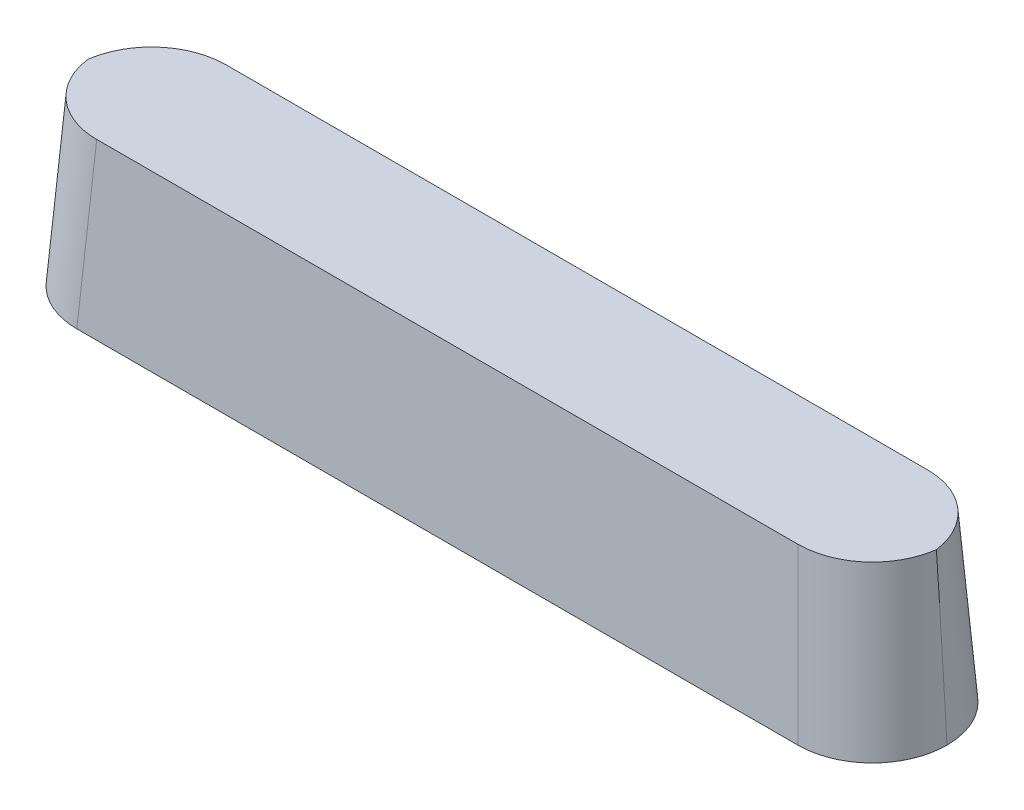
ISO-10303-21;
HEADER;
FILE_DESCRIPTION(('STEP AP214'),'2;1');
FILE_NAME('part.step','',(''),(''),'','','');
FILE_SCHEMA(('AUTOMOTIVE_DESIGN { 1 0 10303 214 1 1 1 1 }'));
ENDSEC;
DATA;
#1=APPLICATION_CONTEXT('core data for automotive mechanical design processes');
#2=APPLICATION_PROTOCOL_DEFINITION('international standard','automotive_design',2000,#1);
#3=PRODUCT_CONTEXT('',#1,'mechanical');
#4=PRODUCT('Part','Part','',(#3));
#5=PRODUCT_RELATED_PRODUCT_CATEGORY('part','',(#4));
#6=PRODUCT_DEFINITION_FORMATION('','',#4);
#7=PRODUCT_DEFINITION_CONTEXT('part definition',#1,'design');
#8=PRODUCT_DEFINITION('design','',#6,#7);
#9=PRODUCT_DEFINITION_SHAPE('','',#8);
#10=(LENGTH_UNIT() NAMED_UNIT(*) SI_UNIT(.MILLI.,.METRE.));
#11=(NAMED_UNIT(*) PLANE_ANGLE_UNIT() SI_UNIT($,.RADIAN.));
#12=(NAMED_UNIT(*) SI_UNIT($,.STERADIAN.) SOLID_ANGLE_UNIT());
#13=UNCERTAINTY_MEASURE_WITH_UNIT(LENGTH_MEASURE(1.E-05),#10,'distance_accuracy_value','');
#14=(GEOMETRIC_REPRESENTATION_CONTEXT(3) GLOBAL_UNCERTAINTY_ASSIGNED_CONTEXT((#13)) GLOBAL_UNIT_ASSIGNED_CONTEXT((#10,
#11,#12)) REPRESENTATION_CONTEXT('',''));
#15=CARTESIAN_POINT('',(0.,0.,0.));
#16=DIRECTION('',(0.,0.,1.));
#17=DIRECTION('',(1.,0.,0.));
#18=AXIS2_PLACEMENT_3D('',#15,#16,#17);
#19=CARTESIAN_POINT('',(0.,33.,0.));
#20=DIRECTION('',(0.,1.,0.));
#21=DIRECTION('',(0.,0.,1.));
#22=AXIS2_PLACEMENT_3D('',#19,#20,#21);
#23=PLANE('',#22);
#24=CARTESIAN_POINT('',(70.4724770410759,33.,-2.02752295892413));
#25=DIRECTION('',(0.,1.,0.));
#26=DIRECTION('',(-0.707106781186548,0.,-0.707106781186547));
#27=AXIS2_PLACEMENT_3D('',#24,#25,#26);
#28=ELLIPSE('',#27,15.0549956015265,15.);
#29=CARTESIAN_POINT('',(70.5274725505321,33.,13.));
#30=VERTEX_POINT('',#29);
#31=CARTESIAN_POINT('',(85.369914782845,33.,0.));
#32=VERTEX_POINT('',#31);
#33=EDGE_CURVE('E302',#30,#32,#28,.T.);
#34=ORIENTED_EDGE('',*,*,#33,.T.);
#35=CARTESIAN_POINT('',(70.4724770410759,33.,2.02752295892412));
#36=DIRECTION('',(0.,1.,0.));
#37=DIRECTION('',(-0.707106781186552,0.,0.707106781186544));
#38=AXIS2_PLACEMENT_3D('',#35,#36,#37);
#39=ELLIPSE('',#38,15.0549956015265,15.);
#40=CARTESIAN_POINT('',(70.5274725505321,33.,-13.));
#41=VERTEX_POINT('',#40);
#42=EDGE_CURVE('E215',#32,#41,#39,.T.);
#43=ORIENTED_EDGE('',*,*,#42,.T.);
#44=DIRECTION('',(-1.,0.,0.));
#45=VECTOR('',#44,1.);
#46=CARTESIAN_POINT('',(85.5,33.,-13.));
#47=LINE('',#46,#45);
#48=CARTESIAN_POINT('',(-70.5274725505321,33.,-13.));
#49=VERTEX_POINT('',#48);
#50=EDGE_CURVE('E160',#41,#49,#47,.T.);
#51=ORIENTED_EDGE('',*,*,#50,.T.);
#52=CARTESIAN_POINT('',(-70.4724770410758,33.,2.02752295892412));
#53=DIRECTION('',(0.,1.,0.));
#54=DIRECTION('',(0.707106781186552,0.,0.707106781186544));
#55=AXIS2_PLACEMENT_3D('',#52,#53,#54);
#56=ELLIPSE('',#55,15.0549956015265,15.);
#57=CARTESIAN_POINT('',(-85.3699147828449,33.,0.));
#58=VERTEX_POINT('',#57);
#59=EDGE_CURVE('E298',#49,#58,#56,.T.);
#60=ORIENTED_EDGE('',*,*,#59,.T.);
#61=CARTESIAN_POINT('',(-70.4724770410758,33.,-2.02752295892413));
#62=DIRECTION('',(0.,1.,0.));
#63=DIRECTION('',(0.707106781186548,0.,-0.707106781186547));
#64=AXIS2_PLACEMENT_3D('',#61,#62,#63);
#65=ELLIPSE('',#64,15.0549956015265,15.);
#66=CARTESIAN_POINT('',(-70.5274725505321,33.,13.));
#67=VERTEX_POINT('',#66);
#68=EDGE_CURVE('E296',#58,#67,#65,.T.);
#69=ORIENTED_EDGE('',*,*,#68,.T.);
#70=DIRECTION('',(1.,0.,0.));
#71=VECTOR('',#70,1.);
#72=CARTESIAN_POINT('',(85.5,33.,13.));
#73=LINE('',#72,#71);
#74=EDGE_CURVE('E291',#67,#30,#73,.T.);
#75=ORIENTED_EDGE('',*,*,#74,.T.);
#76=EDGE_LOOP('',(#34,#43,#51,#60,#69,#75));
#77=FACE_BOUND('',#76,.T.);
#78=ADVANCED_FACE('F44',(#77),#23,.T.);
#79=CARTESIAN_POINT('',(0.,0.,0.));
#80=DIRECTION('',(0.,1.,0.));
#81=DIRECTION('',(0.,0.,1.));
#82=AXIS2_PLACEMENT_3D('',#79,#80,#81);
#83=PLANE('',#82);
#84=DIRECTION('',(-1.,0.,0.));
#85=VECTOR('',#84,1.);
#86=CARTESIAN_POINT('',(87.5,0.,-15.));
#87=LINE('',#86,#85);
#88=CARTESIAN_POINT('',(72.5274725505322,0.,-15.));
#89=VERTEX_POINT('',#88);
#90=CARTESIAN_POINT('',(-72.5274725505321,0.,-15.));
#91=VERTEX_POINT('',#90);
#92=EDGE_CURVE('E48',#89,#91,#87,.T.);
#93=ORIENTED_EDGE('',*,*,#92,.F.);
#94=CARTESIAN_POINT('',(72.4724770410759,0.,0.027522958924139));
#95=DIRECTION('',(0.,1.,0.));
#96=DIRECTION('',(-0.707106781186552,0.,0.707106781186544));
#97=AXIS2_PLACEMENT_3D('',#94,#95,#96);
#98=ELLIPSE('',#97,15.0549956015265,15.);
#99=CARTESIAN_POINT('',(87.5,0.,-0.027472550532124));
#100=VERTEX_POINT('',#99);
#101=EDGE_CURVE('E128',#89,#100,#98,.F.);
#102=ORIENTED_EDGE('',*,*,#101,.T.);
#103=DIRECTION('',(0.,0.,-1.));
#104=VECTOR('',#103,1.);
#105=CARTESIAN_POINT('',(87.5,0.,15.));
#106=LINE('',#105,#104);
#107=CARTESIAN_POINT('',(87.5,0.,0.0274725505321292));
#108=VERTEX_POINT('',#107);
#109=EDGE_CURVE('E116',#108,#100,#106,.T.);
#110=ORIENTED_EDGE('',*,*,#109,.F.);
#111=CARTESIAN_POINT('',(72.4724770410759,0.,-0.0275229589241337));
#112=DIRECTION('',(0.,1.,0.));
#113=DIRECTION('',(-0.707106781186548,0.,-0.707106781186547));
#114=AXIS2_PLACEMENT_3D('',#111,#112,#113);
#115=ELLIPSE('',#114,15.0549956015265,15.);
#116=CARTESIAN_POINT('',(72.5274725505321,0.,15.));
#117=VERTEX_POINT('',#116);
#118=EDGE_CURVE('E68',#108,#117,#115,.F.);
#119=ORIENTED_EDGE('',*,*,#118,.T.);
#120=DIRECTION('',(1.,0.,0.));
#121=VECTOR('',#120,1.);
#122=CARTESIAN_POINT('',(87.5,0.,15.));
#123=LINE('',#122,#121);
#124=CARTESIAN_POINT('',(-72.5274725505321,0.,15.));
#125=VERTEX_POINT('',#124);
#126=EDGE_CURVE('E122',#125,#117,#123,.T.);
#127=ORIENTED_EDGE('',*,*,#126,.F.);
#128=CARTESIAN_POINT('',(-72.4724770410758,0.,-0.0275229589241337));
#129=DIRECTION('',(0.,1.,0.));
#130=DIRECTION('',(0.707106781186548,0.,-0.707106781186547));
#131=AXIS2_PLACEMENT_3D('',#128,#129,#130);
#132=ELLIPSE('',#131,15.0549956015265,15.);
#133=CARTESIAN_POINT('',(-87.5,0.,0.0274725505321309));
#134=VERTEX_POINT('',#133);
#135=EDGE_CURVE('E139',#125,#134,#132,.F.);
#136=ORIENTED_EDGE('',*,*,#135,.T.);
#137=DIRECTION('',(0.,0.,1.));
#138=VECTOR('',#137,1.);
#139=CARTESIAN_POINT('',(-87.5,0.,15.));
#140=LINE('',#139,#138);
#141=CARTESIAN_POINT('',(-87.5,0.,-0.0274725505321222));
#142=VERTEX_POINT('',#141);
#143=EDGE_CURVE('E224',#142,#134,#140,.T.);
#144=ORIENTED_EDGE('',*,*,#143,.F.);
#145=CARTESIAN_POINT('',(-72.4724770410758,0.,0.0275229589241389));
#146=DIRECTION('',(0.,1.,0.));
#147=DIRECTION('',(0.707106781186552,0.,0.707106781186544));
#148=AXIS2_PLACEMENT_3D('',#145,#146,#147);
#149=ELLIPSE('',#148,15.0549956015265,15.);
#150=EDGE_CURVE('E135',#142,#91,#149,.F.);
#151=ORIENTED_EDGE('',*,*,#150,.T.);
#152=EDGE_LOOP('',(#93,#102,#110,#119,#127,#136,#144,#151));
#153=FACE_BOUND('',#152,.T.);
#154=ADVANCED_FACE('F126',(#153),#83,.F.);
#155=CARTESIAN_POINT('',(0.,0.905763952424519,14.9451052150046));
#156=DIRECTION('',(0.,-0.0604950604018904,-0.998168496631191));
#157=DIRECTION('',(0.,0.998168496631191,-0.0604950604018904));
#158=AXIS2_PLACEMENT_3D('',#155,#156,#157);
#159=PLANE('',#158);
#160=ORIENTED_EDGE('',*,*,#126,.T.);
#161=DIRECTION('',(-0.0603846678639169,0.996347019754628,-0.0603846678639168));
#162=VECTOR('',#161,1.);
#163=CARTESIAN_POINT('',(72.2083204172576,5.26601019902928,14.6808478667255));
#164=LINE('',#163,#162);
#165=EDGE_CURVE('E134',#117,#30,#164,.T.);
#166=ORIENTED_EDGE('',*,*,#165,.T.);
#167=ORIENTED_EDGE('',*,*,#74,.F.);
#168=DIRECTION('',(0.0603846678639169,0.996347019754628,-0.0603846678639168));
#169=VECTOR('',#168,1.);
#170=CARTESIAN_POINT('',(-72.2083204172576,5.26601019902928,14.6808478667255));
#171=LINE('',#170,#169);
#172=EDGE_CURVE('E137',#67,#125,#171,.F.);
#173=ORIENTED_EDGE('',*,*,#172,.T.);
#174=EDGE_LOOP('',(#160,#166,#167,#173));
#175=FACE_BOUND('',#174,.T.);
#176=ADVANCED_FACE('F184',(#175),#159,.F.);
#177=CARTESIAN_POINT('',(-87.17978042086,5.2836230558097,0.));
#178=DIRECTION('',(0.998168496631191,-0.0604950604018904,0.));
#179=DIRECTION('',(0.0604950604018904,0.998168496631191,0.));
#180=AXIS2_PLACEMENT_3D('',#177,#178,#179);
#181=PLANE('',#180);
#182=DIRECTION('',(0.0603846678639169,0.996347019754628,-0.0603846678639168));
#183=VECTOR('',#182,1.);
#184=CARTESIAN_POINT('',(-87.1808478667254,5.26601019902928,-0.291679582742372));
#185=LINE('',#184,#183);
#186=CARTESIAN_POINT('',(-87.4725274494678,0.4532970837801,0.));
#187=VERTEX_POINT('',#186);
#188=EDGE_CURVE('E54',#134,#187,#185,.T.);
#189=ORIENTED_EDGE('',*,*,#188,.T.);
#190=DIRECTION('',(0.0603846678639169,0.996347019754628,0.0603846678639162));
#191=VECTOR('',#190,1.);
#192=CARTESIAN_POINT('',(-87.1808478667254,5.26601019902928,0.291679582742374));
#193=LINE('',#192,#191);
#194=EDGE_CURVE('E12',#187,#142,#193,.F.);
#195=ORIENTED_EDGE('',*,*,#194,.T.);
#196=ORIENTED_EDGE('',*,*,#143,.T.);
#197=EDGE_LOOP('',(#189,#195,#196));
#198=FACE_BOUND('',#197,.T.);
#199=ADVANCED_FACE('F235',(#198),#181,.F.);
#200=CARTESIAN_POINT('',(87.17978042086,5.2836230558097,0.));
#201=DIRECTION('',(-0.998168496631191,-0.0604950604018904,0.));
#202=DIRECTION('',(0.0604950604018904,-0.998168496631191,0.));
#203=AXIS2_PLACEMENT_3D('',#200,#201,#202);
#204=PLANE('',#203);
#205=ORIENTED_EDGE('',*,*,#109,.T.);
#206=DIRECTION('',(-0.0603846678639169,0.996347019754628,0.0603846678639162));
#207=VECTOR('',#206,1.);
#208=CARTESIAN_POINT('',(87.1808478667255,5.26601019902929,0.291679582742374));
#209=LINE('',#208,#207);
#210=CARTESIAN_POINT('',(87.4725274494679,0.453297083780101,0.));
#211=VERTEX_POINT('',#210);
#212=EDGE_CURVE('E119',#100,#211,#209,.T.);
#213=ORIENTED_EDGE('',*,*,#212,.T.);
#214=DIRECTION('',(-0.0603846678639169,0.996347019754628,-0.0603846678639168));
#215=VECTOR('',#214,1.);
#216=CARTESIAN_POINT('',(87.1808478667255,5.26601019902929,-0.291679582742372));
#217=LINE('',#216,#215);
#218=EDGE_CURVE('E114',#211,#108,#217,.F.);
#219=ORIENTED_EDGE('',*,*,#218,.T.);
#220=EDGE_LOOP('',(#205,#213,#219));
#221=FACE_BOUND('',#220,.T.);
#222=ADVANCED_FACE('F115',(#221),#204,.F.);
#223=CARTESIAN_POINT('',(0.,0.905763952424509,-14.9451052150046));
#224=DIRECTION('',(0.,-0.0604950604018897,0.998168496631191));
#225=DIRECTION('',(0.,-0.998168496631191,-0.0604950604018897));
#226=AXIS2_PLACEMENT_3D('',#223,#224,#225);
#227=PLANE('',#226);
#228=ORIENTED_EDGE('',*,*,#50,.F.);
#229=DIRECTION('',(-0.0603846678639169,0.996347019754628,0.0603846678639162));
#230=VECTOR('',#229,1.);
#231=CARTESIAN_POINT('',(72.2083204172576,5.26601019902927,-14.6808478667255));
#232=LINE('',#231,#230);
#233=EDGE_CURVE('E214',#41,#89,#232,.F.);
#234=ORIENTED_EDGE('',*,*,#233,.T.);
#235=ORIENTED_EDGE('',*,*,#92,.T.);
#236=DIRECTION('',(0.0603846678639169,0.996347019754628,0.0603846678639162));
#237=VECTOR('',#236,1.);
#238=CARTESIAN_POINT('',(-72.2083204172576,5.26601019902927,-14.6808478667255));
#239=LINE('',#238,#237);
#240=EDGE_CURVE('E211',#91,#49,#239,.T.);
#241=ORIENTED_EDGE('',*,*,#240,.T.);
#242=EDGE_LOOP('',(#228,#234,#235,#241));
#243=FACE_BOUND('',#242,.T.);
#244=ADVANCED_FACE('F246',(#243),#227,.F.);
#245=CARTESIAN_POINT('',(72.2083204172576,4.35858429300093,-0.291679582742372));
#246=DIRECTION('',(-0.0603846678639169,0.996347019754628,-0.0603846678639168));
#247=DIRECTION('',(-0.998168496631191,-0.0604950604018904,0.));
#248=AXIS2_PLACEMENT_3D('',#245,#246,#247);
#249=CYLINDRICAL_SURFACE('',#248,15.);
#250=ORIENTED_EDGE('',*,*,#118,.F.);
#251=ORIENTED_EDGE('',*,*,#218,.F.);
#252=CARTESIAN_POINT('',(72.5,-0.454128822248252,0.));
#253=DIRECTION('',(0.,0.,-1.));
#254=DIRECTION('',(-0.0604950604018904,0.998168496631191,0.));
#255=AXIS2_PLACEMENT_3D('',#252,#253,#254);
#256=ELLIPSE('',#255,248.407427425187,15.);
#257=EDGE_CURVE('E159',#32,#211,#256,.T.);
#258=ORIENTED_EDGE('',*,*,#257,.F.);
#259=ORIENTED_EDGE('',*,*,#33,.F.);
#260=ORIENTED_EDGE('',*,*,#165,.F.);
#261=EDGE_LOOP('',(#250,#251,#258,#259,#260));
#262=FACE_BOUND('',#261,.T.);
#263=ADVANCED_FACE('F132',(#262),#249,.T.);
#264=CARTESIAN_POINT('',(72.2083204172576,4.35858429300093,0.291679582742374));
#265=DIRECTION('',(-0.0603846678639169,0.996347019754628,0.0603846678639162));
#266=DIRECTION('',(-0.998168496631191,-0.0604950604018904,0.));
#267=AXIS2_PLACEMENT_3D('',#264,#265,#266);
#268=CYLINDRICAL_SURFACE('',#267,15.);
#269=ORIENTED_EDGE('',*,*,#101,.F.);
#270=ORIENTED_EDGE('',*,*,#233,.F.);
#271=ORIENTED_EDGE('',*,*,#42,.F.);
#272=ORIENTED_EDGE('',*,*,#257,.T.);
#273=ORIENTED_EDGE('',*,*,#212,.F.);
#274=EDGE_LOOP('',(#269,#270,#271,#272,#273));
#275=FACE_BOUND('',#274,.T.);
#276=ADVANCED_FACE('F275',(#275),#268,.T.);
#277=CARTESIAN_POINT('',(-72.2083204172576,4.35858429300093,-0.291679582742372));
#278=DIRECTION('',(0.0603846678639169,0.996347019754628,-0.0603846678639168));
#279=DIRECTION('',(-0.998168496631191,0.0604950604018904,0.));
#280=AXIS2_PLACEMENT_3D('',#277,#278,#279);
#281=CYLINDRICAL_SURFACE('',#280,15.);
#282=ORIENTED_EDGE('',*,*,#172,.F.);
#283=ORIENTED_EDGE('',*,*,#68,.F.);
#284=CARTESIAN_POINT('',(-72.5,-0.454128822248252,0.));
#285=DIRECTION('',(0.,0.,1.));
#286=DIRECTION('',(0.0604950604018904,0.998168496631191,0.));
#287=AXIS2_PLACEMENT_3D('',#284,#285,#286);
#288=ELLIPSE('',#287,248.407427425187,15.);
#289=EDGE_CURVE('E161',#187,#58,#288,.F.);
#290=ORIENTED_EDGE('',*,*,#289,.F.);
#291=ORIENTED_EDGE('',*,*,#188,.F.);
#292=ORIENTED_EDGE('',*,*,#135,.F.);
#293=EDGE_LOOP('',(#282,#283,#290,#291,#292));
#294=FACE_BOUND('',#293,.T.);
#295=ADVANCED_FACE('F46',(#294),#281,.T.);
#296=CARTESIAN_POINT('',(-72.2083204172576,4.35858429300093,0.291679582742374));
#297=DIRECTION('',(0.0603846678639169,0.996347019754628,0.0603846678639162));
#298=DIRECTION('',(-0.998168496631191,0.0604950604018904,0.));
#299=AXIS2_PLACEMENT_3D('',#296,#297,#298);
#300=CYLINDRICAL_SURFACE('',#299,15.);
#301=ORIENTED_EDGE('',*,*,#150,.F.);
#302=ORIENTED_EDGE('',*,*,#194,.F.);
#303=ORIENTED_EDGE('',*,*,#289,.T.);
#304=ORIENTED_EDGE('',*,*,#59,.F.);
#305=ORIENTED_EDGE('',*,*,#240,.F.);
#306=EDGE_LOOP('',(#301,#302,#303,#304,#305));
#307=FACE_BOUND('',#306,.T.);
#308=ADVANCED_FACE('F325',(#307),#300,.T.);
#309=CLOSED_SHELL('',(#78,#154,#176,#199,#222,#244,#263,#276,#295,#308));
#310=MANIFOLD_SOLID_BREP('B2',#309);
#311=ADVANCED_BREP_SHAPE_REPRESENTATION('',(#18,#310),#14);
#312=SHAPE_DEFINITION_REPRESENTATION(#9,#311);
ENDSEC;
END-ISO-10303-21;
